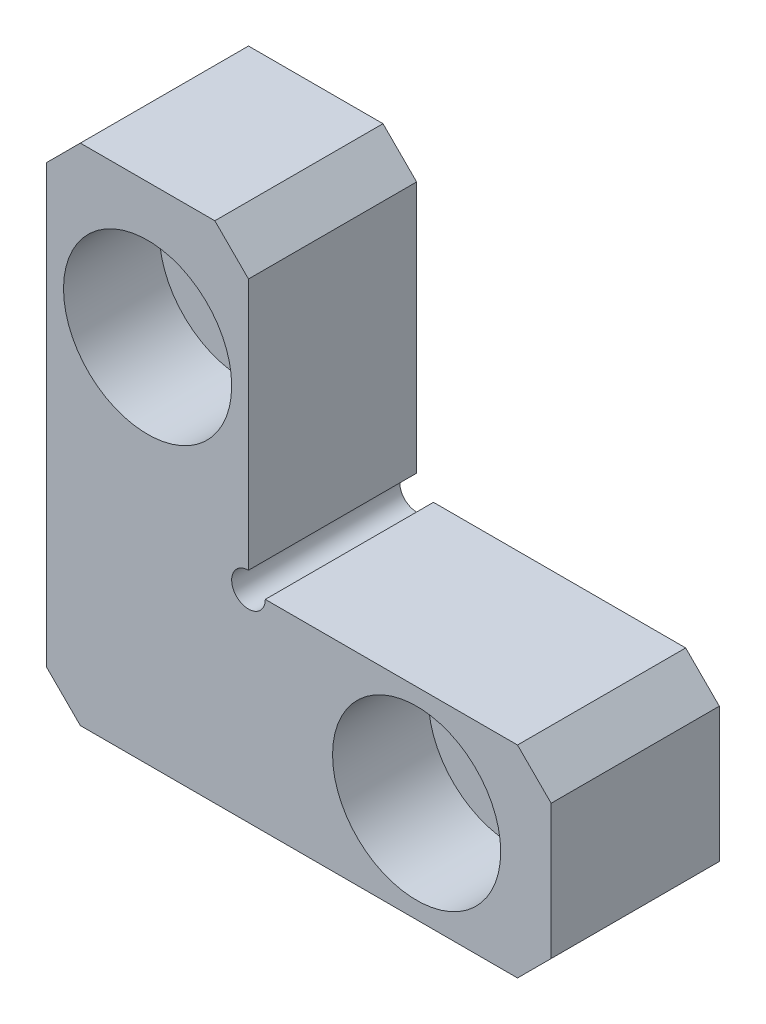
ISO-10303-21;
HEADER;
FILE_DESCRIPTION(('STEP AP214'),'2;1');
FILE_NAME('part.step','',(''),(''),'','','');
FILE_SCHEMA(('AUTOMOTIVE_DESIGN { 1 0 10303 214 1 1 1 1 }'));
ENDSEC;
DATA;
#1=APPLICATION_CONTEXT('core data for automotive mechanical design processes');
#2=APPLICATION_PROTOCOL_DEFINITION('international standard','automotive_design',2000,#1);
#3=PRODUCT_CONTEXT('',#1,'mechanical');
#4=PRODUCT('Part','Part','',(#3));
#5=PRODUCT_RELATED_PRODUCT_CATEGORY('part','',(#4));
#6=PRODUCT_DEFINITION_FORMATION('','',#4);
#7=PRODUCT_DEFINITION_CONTEXT('part definition',#1,'design');
#8=PRODUCT_DEFINITION('design','',#6,#7);
#9=PRODUCT_DEFINITION_SHAPE('','',#8);
#10=(LENGTH_UNIT() NAMED_UNIT(*) SI_UNIT(.MILLI.,.METRE.));
#11=(NAMED_UNIT(*) PLANE_ANGLE_UNIT() SI_UNIT($,.RADIAN.));
#12=(NAMED_UNIT(*) SI_UNIT($,.STERADIAN.) SOLID_ANGLE_UNIT());
#13=UNCERTAINTY_MEASURE_WITH_UNIT(LENGTH_MEASURE(1.E-05),#10,'distance_accuracy_value','');
#14=(GEOMETRIC_REPRESENTATION_CONTEXT(3) GLOBAL_UNCERTAINTY_ASSIGNED_CONTEXT((#13)) GLOBAL_UNIT_ASSIGNED_CONTEXT((#10,
#11,#12)) REPRESENTATION_CONTEXT('',''));
#15=CARTESIAN_POINT('',(0.,0.,0.));
#16=DIRECTION('',(0.,0.,1.));
#17=DIRECTION('',(1.,0.,0.));
#18=AXIS2_PLACEMENT_3D('',#15,#16,#17);
#19=CARTESIAN_POINT('',(30.,0.,5.));
#20=DIRECTION('',(0.,1.,0.));
#21=DIRECTION('',(-1.,0.,0.));
#22=AXIS2_PLACEMENT_3D('',#19,#20,#21);
#23=PLANE('',#22);
#24=DIRECTION('',(1.,0.,0.));
#25=VECTOR('',#24,1.);
#26=CARTESIAN_POINT('',(30.,0.,5.));
#27=LINE('',#26,#25);
#28=CARTESIAN_POINT('',(2.,0.,5.));
#29=VERTEX_POINT('',#28);
#30=CARTESIAN_POINT('',(28.,0.,5.));
#31=VERTEX_POINT('',#30);
#32=EDGE_CURVE('E159',#29,#31,#27,.T.);
#33=ORIENTED_EDGE('',*,*,#32,.F.);
#34=DIRECTION('',(0.,0.,-1.));
#35=VECTOR('',#34,1.);
#36=CARTESIAN_POINT('',(2.,0.,5.));
#37=LINE('',#36,#35);
#38=CARTESIAN_POINT('',(2.,0.,-5.));
#39=VERTEX_POINT('',#38);
#40=EDGE_CURVE('E162',#29,#39,#37,.T.);
#41=ORIENTED_EDGE('',*,*,#40,.T.);
#42=DIRECTION('',(1.,0.,0.));
#43=VECTOR('',#42,1.);
#44=CARTESIAN_POINT('',(30.,0.,-5.));
#45=LINE('',#44,#43);
#46=CARTESIAN_POINT('',(28.,0.,-5.));
#47=VERTEX_POINT('',#46);
#48=EDGE_CURVE('E218',#39,#47,#45,.T.);
#49=ORIENTED_EDGE('',*,*,#48,.T.);
#50=DIRECTION('',(0.,0.,1.));
#51=VECTOR('',#50,1.);
#52=CARTESIAN_POINT('',(28.,0.,5.));
#53=LINE('',#52,#51);
#54=EDGE_CURVE('E160',#47,#31,#53,.T.);
#55=ORIENTED_EDGE('',*,*,#54,.T.);
#56=EDGE_LOOP('',(#33,#41,#49,#55));
#57=FACE_BOUND('',#56,.T.);
#58=ADVANCED_FACE('F38',(#57),#23,.F.);
#59=CARTESIAN_POINT('',(30.,12.,5.));
#60=DIRECTION('',(-1.,0.,0.));
#61=DIRECTION('',(0.,0.,1.));
#62=AXIS2_PLACEMENT_3D('',#59,#60,#61);
#63=PLANE('',#62);
#64=DIRECTION('',(0.,1.,0.));
#65=VECTOR('',#64,1.);
#66=CARTESIAN_POINT('',(30.,12.,5.));
#67=LINE('',#66,#65);
#68=CARTESIAN_POINT('',(30.,2.,5.));
#69=VERTEX_POINT('',#68);
#70=CARTESIAN_POINT('',(30.,9.99999999999999,5.));
#71=VERTEX_POINT('',#70);
#72=EDGE_CURVE('E234',#69,#71,#67,.T.);
#73=ORIENTED_EDGE('',*,*,#72,.F.);
#74=DIRECTION('',(0.,0.,-1.));
#75=VECTOR('',#74,1.);
#76=CARTESIAN_POINT('',(30.,2.,5.));
#77=LINE('',#76,#75);
#78=CARTESIAN_POINT('',(30.,2.,-5.));
#79=VERTEX_POINT('',#78);
#80=EDGE_CURVE('E192',#69,#79,#77,.T.);
#81=ORIENTED_EDGE('',*,*,#80,.T.);
#82=DIRECTION('',(0.,1.,0.));
#83=VECTOR('',#82,1.);
#84=CARTESIAN_POINT('',(30.,12.,-5.));
#85=LINE('',#84,#83);
#86=CARTESIAN_POINT('',(30.,9.99999999999999,-5.));
#87=VERTEX_POINT('',#86);
#88=EDGE_CURVE('E153',#79,#87,#85,.T.);
#89=ORIENTED_EDGE('',*,*,#88,.T.);
#90=DIRECTION('',(0.,0.,1.));
#91=VECTOR('',#90,1.);
#92=CARTESIAN_POINT('',(30.,9.99999999999999,5.));
#93=LINE('',#92,#91);
#94=EDGE_CURVE('E190',#87,#71,#93,.T.);
#95=ORIENTED_EDGE('',*,*,#94,.T.);
#96=EDGE_LOOP('',(#73,#81,#89,#95));
#97=FACE_BOUND('',#96,.T.);
#98=ADVANCED_FACE('F226',(#97),#63,.F.);
#99=CARTESIAN_POINT('',(12.,12.,5.));
#100=DIRECTION('',(0.,-1.,0.));
#101=DIRECTION('',(1.,0.,0.));
#102=AXIS2_PLACEMENT_3D('',#99,#100,#101);
#103=PLANE('',#102);
#104=DIRECTION('',(-1.,0.,0.));
#105=VECTOR('',#104,1.);
#106=CARTESIAN_POINT('',(12.,12.,-5.));
#107=LINE('',#106,#105);
#108=CARTESIAN_POINT('',(28.,12.,-5.));
#109=VERTEX_POINT('',#108);
#110=CARTESIAN_POINT('',(13.,12.,-5.));
#111=VERTEX_POINT('',#110);
#112=EDGE_CURVE('E149',#109,#111,#107,.T.);
#113=ORIENTED_EDGE('',*,*,#112,.T.);
#114=DIRECTION('',(0.,0.,1.));
#115=VECTOR('',#114,1.);
#116=CARTESIAN_POINT('',(13.,12.,-5.));
#117=LINE('',#116,#115);
#118=CARTESIAN_POINT('',(13.,12.,5.));
#119=VERTEX_POINT('',#118);
#120=EDGE_CURVE('E53',#111,#119,#117,.T.);
#121=ORIENTED_EDGE('',*,*,#120,.T.);
#122=DIRECTION('',(-1.,0.,0.));
#123=VECTOR('',#122,1.);
#124=CARTESIAN_POINT('',(12.,12.,5.));
#125=LINE('',#124,#123);
#126=CARTESIAN_POINT('',(28.,12.,5.));
#127=VERTEX_POINT('',#126);
#128=EDGE_CURVE('E214',#127,#119,#125,.T.);
#129=ORIENTED_EDGE('',*,*,#128,.F.);
#130=DIRECTION('',(0.,0.,-1.));
#131=VECTOR('',#130,1.);
#132=CARTESIAN_POINT('',(28.,12.,5.));
#133=LINE('',#132,#131);
#134=EDGE_CURVE('E195',#127,#109,#133,.T.);
#135=ORIENTED_EDGE('',*,*,#134,.T.);
#136=EDGE_LOOP('',(#113,#121,#129,#135));
#137=FACE_BOUND('',#136,.T.);
#138=ADVANCED_FACE('F236',(#137),#103,.F.);
#139=CARTESIAN_POINT('',(12.,30.,5.));
#140=DIRECTION('',(-1.,0.,0.));
#141=DIRECTION('',(0.,-1.,0.));
#142=AXIS2_PLACEMENT_3D('',#139,#140,#141);
#143=PLANE('',#142);
#144=DIRECTION('',(0.,1.,0.));
#145=VECTOR('',#144,1.);
#146=CARTESIAN_POINT('',(12.,30.,5.));
#147=LINE('',#146,#145);
#148=CARTESIAN_POINT('',(12.,13.,5.));
#149=VERTEX_POINT('',#148);
#150=CARTESIAN_POINT('',(12.,28.,5.));
#151=VERTEX_POINT('',#150);
#152=EDGE_CURVE('E140',#149,#151,#147,.T.);
#153=ORIENTED_EDGE('',*,*,#152,.F.);
#154=DIRECTION('',(0.,0.,1.));
#155=VECTOR('',#154,1.);
#156=CARTESIAN_POINT('',(12.,13.,-5.));
#157=LINE('',#156,#155);
#158=CARTESIAN_POINT('',(12.,13.,-5.));
#159=VERTEX_POINT('',#158);
#160=EDGE_CURVE('E128',#149,#159,#157,.F.);
#161=ORIENTED_EDGE('',*,*,#160,.T.);
#162=DIRECTION('',(0.,1.,0.));
#163=VECTOR('',#162,1.);
#164=CARTESIAN_POINT('',(12.,30.,-5.));
#165=LINE('',#164,#163);
#166=CARTESIAN_POINT('',(12.,28.,-5.));
#167=VERTEX_POINT('',#166);
#168=EDGE_CURVE('E138',#159,#167,#165,.T.);
#169=ORIENTED_EDGE('',*,*,#168,.T.);
#170=DIRECTION('',(0.,0.,1.));
#171=VECTOR('',#170,1.);
#172=CARTESIAN_POINT('',(12.,28.,5.));
#173=LINE('',#172,#171);
#174=EDGE_CURVE('E47',#167,#151,#173,.T.);
#175=ORIENTED_EDGE('',*,*,#174,.T.);
#176=EDGE_LOOP('',(#153,#161,#169,#175));
#177=FACE_BOUND('',#176,.T.);
#178=ADVANCED_FACE('F136',(#177),#143,.F.);
#179=CARTESIAN_POINT('',(0.,30.,5.));
#180=DIRECTION('',(0.,-1.,0.));
#181=DIRECTION('',(0.,0.,-1.));
#182=AXIS2_PLACEMENT_3D('',#179,#180,#181);
#183=PLANE('',#182);
#184=DIRECTION('',(-1.,0.,0.));
#185=VECTOR('',#184,1.);
#186=CARTESIAN_POINT('',(0.,30.,5.));
#187=LINE('',#186,#185);
#188=CARTESIAN_POINT('',(10.,30.,5.));
#189=VERTEX_POINT('',#188);
#190=CARTESIAN_POINT('',(2.,30.,5.));
#191=VERTEX_POINT('',#190);
#192=EDGE_CURVE('E208',#189,#191,#187,.T.);
#193=ORIENTED_EDGE('',*,*,#192,.F.);
#194=DIRECTION('',(0.,0.,-1.));
#195=VECTOR('',#194,1.);
#196=CARTESIAN_POINT('',(10.,30.,5.));
#197=LINE('',#196,#195);
#198=CARTESIAN_POINT('',(10.,30.,-5.));
#199=VERTEX_POINT('',#198);
#200=EDGE_CURVE('E199',#189,#199,#197,.T.);
#201=ORIENTED_EDGE('',*,*,#200,.T.);
#202=DIRECTION('',(-1.,0.,0.));
#203=VECTOR('',#202,1.);
#204=CARTESIAN_POINT('',(0.,30.,-5.));
#205=LINE('',#204,#203);
#206=CARTESIAN_POINT('',(2.,30.,-5.));
#207=VERTEX_POINT('',#206);
#208=EDGE_CURVE('E148',#199,#207,#205,.T.);
#209=ORIENTED_EDGE('',*,*,#208,.T.);
#210=DIRECTION('',(0.,0.,1.));
#211=VECTOR('',#210,1.);
#212=CARTESIAN_POINT('',(2.,30.,5.));
#213=LINE('',#212,#211);
#214=EDGE_CURVE('E61',#207,#191,#213,.T.);
#215=ORIENTED_EDGE('',*,*,#214,.T.);
#216=EDGE_LOOP('',(#193,#201,#209,#215));
#217=FACE_BOUND('',#216,.T.);
#218=ADVANCED_FACE('F210',(#217),#183,.F.);
#219=CARTESIAN_POINT('',(0.,0.,5.));
#220=DIRECTION('',(1.,0.,0.));
#221=DIRECTION('',(0.,0.,-1.));
#222=AXIS2_PLACEMENT_3D('',#219,#220,#221);
#223=PLANE('',#222);
#224=DIRECTION('',(0.,-1.,0.));
#225=VECTOR('',#224,1.);
#226=CARTESIAN_POINT('',(0.,0.,-5.));
#227=LINE('',#226,#225);
#228=CARTESIAN_POINT('',(0.,28.,-5.));
#229=VERTEX_POINT('',#228);
#230=CARTESIAN_POINT('',(0.,2.,-5.));
#231=VERTEX_POINT('',#230);
#232=EDGE_CURVE('E151',#229,#231,#227,.T.);
#233=ORIENTED_EDGE('',*,*,#232,.T.);
#234=DIRECTION('',(0.,0.,1.));
#235=VECTOR('',#234,1.);
#236=CARTESIAN_POINT('',(0.,2.,5.));
#237=LINE('',#236,#235);
#238=CARTESIAN_POINT('',(0.,2.,5.));
#239=VERTEX_POINT('',#238);
#240=EDGE_CURVE('E178',#231,#239,#237,.T.);
#241=ORIENTED_EDGE('',*,*,#240,.T.);
#242=DIRECTION('',(0.,-1.,0.));
#243=VECTOR('',#242,1.);
#244=CARTESIAN_POINT('',(0.,0.,5.));
#245=LINE('',#244,#243);
#246=CARTESIAN_POINT('',(0.,28.,5.));
#247=VERTEX_POINT('',#246);
#248=EDGE_CURVE('E163',#247,#239,#245,.T.);
#249=ORIENTED_EDGE('',*,*,#248,.F.);
#250=DIRECTION('',(0.,0.,-1.));
#251=VECTOR('',#250,1.);
#252=CARTESIAN_POINT('',(0.,28.,5.));
#253=LINE('',#252,#251);
#254=EDGE_CURVE('E175',#247,#229,#253,.T.);
#255=ORIENTED_EDGE('',*,*,#254,.T.);
#256=EDGE_LOOP('',(#233,#241,#249,#255));
#257=FACE_BOUND('',#256,.T.);
#258=ADVANCED_FACE('F271',(#257),#223,.F.);
#259=CARTESIAN_POINT('',(0.,0.,5.));
#260=DIRECTION('',(0.,0.,-1.));
#261=DIRECTION('',(-1.,0.,0.));
#262=AXIS2_PLACEMENT_3D('',#259,#260,#261);
#263=PLANE('',#262);
#264=CARTESIAN_POINT('',(6.,22.,5.));
#265=DIRECTION('',(0.,0.,1.));
#266=DIRECTION('',(1.,0.,0.));
#267=AXIS2_PLACEMENT_3D('',#264,#265,#266);
#268=CIRCLE('',#267,5.);
#269=CARTESIAN_POINT('',(11.,22.,5.));
#270=VERTEX_POINT('',#269);
#271=EDGE_CURVE('E261',#270,#270,#268,.T.);
#272=ORIENTED_EDGE('',*,*,#271,.F.);
#273=EDGE_LOOP('',(#272));
#274=FACE_BOUND('',#273,.T.);
#275=CARTESIAN_POINT('',(22.,6.,5.));
#276=DIRECTION('',(0.,0.,1.));
#277=DIRECTION('',(1.,0.,0.));
#278=AXIS2_PLACEMENT_3D('',#275,#276,#277);
#279=CIRCLE('',#278,5.);
#280=CARTESIAN_POINT('',(27.,6.,5.));
#281=VERTEX_POINT('',#280);
#282=EDGE_CURVE('E249',#281,#281,#279,.T.);
#283=ORIENTED_EDGE('',*,*,#282,.F.);
#284=EDGE_LOOP('',(#283));
#285=FACE_BOUND('',#284,.T.);
#286=ORIENTED_EDGE('',*,*,#128,.T.);
#287=CARTESIAN_POINT('',(12.,12.,5.));
#288=DIRECTION('',(0.,0.,1.));
#289=DIRECTION('',(1.,0.,0.));
#290=AXIS2_PLACEMENT_3D('',#287,#288,#289);
#291=CIRCLE('',#290,0.999999999999999);
#292=EDGE_CURVE('E141',#149,#119,#291,.T.);
#293=ORIENTED_EDGE('',*,*,#292,.F.);
#294=ORIENTED_EDGE('',*,*,#152,.T.);
#295=DIRECTION('',(0.707106781186546,-0.707106781186549,0.));
#296=VECTOR('',#295,1.);
#297=CARTESIAN_POINT('',(10.,30.,5.));
#298=LINE('',#297,#296);
#299=EDGE_CURVE('E182',#151,#189,#298,.F.);
#300=ORIENTED_EDGE('',*,*,#299,.T.);
#301=ORIENTED_EDGE('',*,*,#192,.T.);
#302=DIRECTION('',(0.707106781186548,0.707106781186547,0.));
#303=VECTOR('',#302,1.);
#304=CARTESIAN_POINT('',(0.,28.,5.));
#305=LINE('',#304,#303);
#306=EDGE_CURVE('E180',#191,#247,#305,.F.);
#307=ORIENTED_EDGE('',*,*,#306,.T.);
#308=ORIENTED_EDGE('',*,*,#248,.T.);
#309=DIRECTION('',(-0.707106781186547,0.707106781186548,0.));
#310=VECTOR('',#309,1.);
#311=CARTESIAN_POINT('',(2.,0.,5.));
#312=LINE('',#311,#310);
#313=EDGE_CURVE('E188',#239,#29,#312,.F.);
#314=ORIENTED_EDGE('',*,*,#313,.T.);
#315=ORIENTED_EDGE('',*,*,#32,.T.);
#316=DIRECTION('',(-0.707106781186549,-0.707106781186546,0.));
#317=VECTOR('',#316,1.);
#318=CARTESIAN_POINT('',(30.,2.,5.));
#319=LINE('',#318,#317);
#320=EDGE_CURVE('E186',#31,#69,#319,.F.);
#321=ORIENTED_EDGE('',*,*,#320,.T.);
#322=ORIENTED_EDGE('',*,*,#72,.T.);
#323=DIRECTION('',(0.707106781186545,-0.70710678118655,0.));
#324=VECTOR('',#323,1.);
#325=CARTESIAN_POINT('',(28.,12.,5.));
#326=LINE('',#325,#324);
#327=EDGE_CURVE('E184',#71,#127,#326,.F.);
#328=ORIENTED_EDGE('',*,*,#327,.T.);
#329=EDGE_LOOP('',(#286,#293,#294,#300,#301,#307,#308,#314,#315,#321,#322,#328));
#330=FACE_BOUND('',#329,.T.);
#331=ADVANCED_FACE('F207',(#274,#285,#330),#263,.F.);
#332=CARTESIAN_POINT('',(0.,0.,-5.));
#333=DIRECTION('',(0.,0.,-1.));
#334=DIRECTION('',(-1.,0.,0.));
#335=AXIS2_PLACEMENT_3D('',#332,#333,#334);
#336=PLANE('',#335);
#337=CARTESIAN_POINT('',(12.,12.,-5.));
#338=DIRECTION('',(0.,0.,-1.));
#339=DIRECTION('',(-1.,0.,0.));
#340=AXIS2_PLACEMENT_3D('',#337,#338,#339);
#341=CIRCLE('',#340,0.999999999999999);
#342=EDGE_CURVE('E11',#111,#159,#341,.T.);
#343=ORIENTED_EDGE('',*,*,#342,.F.);
#344=ORIENTED_EDGE('',*,*,#112,.F.);
#345=DIRECTION('',(-0.707106781186545,0.70710678118655,0.));
#346=VECTOR('',#345,1.);
#347=CARTESIAN_POINT('',(20.0000000000001,20.,-5.));
#348=LINE('',#347,#346);
#349=EDGE_CURVE('E169',#109,#87,#348,.F.);
#350=ORIENTED_EDGE('',*,*,#349,.T.);
#351=ORIENTED_EDGE('',*,*,#88,.F.);
#352=DIRECTION('',(0.707106781186549,0.707106781186546,0.));
#353=VECTOR('',#352,1.);
#354=CARTESIAN_POINT('',(13.9999999999999,-14.,-5.));
#355=LINE('',#354,#353);
#356=EDGE_CURVE('E171',#79,#47,#355,.F.);
#357=ORIENTED_EDGE('',*,*,#356,.T.);
#358=ORIENTED_EDGE('',*,*,#48,.F.);
#359=DIRECTION('',(0.707106781186547,-0.707106781186548,0.));
#360=VECTOR('',#359,1.);
#361=CARTESIAN_POINT('',(1.,0.999999999999999,-5.));
#362=LINE('',#361,#360);
#363=EDGE_CURVE('E173',#39,#231,#362,.F.);
#364=ORIENTED_EDGE('',*,*,#363,.T.);
#365=ORIENTED_EDGE('',*,*,#232,.F.);
#366=DIRECTION('',(-0.707106781186548,-0.707106781186547,0.));
#367=VECTOR('',#366,1.);
#368=CARTESIAN_POINT('',(-14.,14.,-5.));
#369=LINE('',#368,#367);
#370=EDGE_CURVE('E166',#229,#207,#369,.F.);
#371=ORIENTED_EDGE('',*,*,#370,.T.);
#372=ORIENTED_EDGE('',*,*,#208,.F.);
#373=DIRECTION('',(-0.707106781186546,0.707106781186549,0.));
#374=VECTOR('',#373,1.);
#375=CARTESIAN_POINT('',(20.,19.9999999999999,-5.));
#376=LINE('',#375,#374);
#377=EDGE_CURVE('E146',#199,#167,#376,.F.);
#378=ORIENTED_EDGE('',*,*,#377,.T.);
#379=ORIENTED_EDGE('',*,*,#168,.F.);
#380=EDGE_LOOP('',(#343,#344,#350,#351,#357,#358,#364,#365,#371,#372,#378,#379));
#381=FACE_BOUND('',#380,.T.);
#382=CARTESIAN_POINT('',(6.,22.,-5.));
#383=DIRECTION('',(0.,0.,1.));
#384=DIRECTION('',(1.,0.,0.));
#385=AXIS2_PLACEMENT_3D('',#382,#383,#384);
#386=CIRCLE('',#385,2.75);
#387=CARTESIAN_POINT('',(8.75,22.,-5.));
#388=VERTEX_POINT('',#387);
#389=EDGE_CURVE('E252',#388,#388,#386,.T.);
#390=ORIENTED_EDGE('',*,*,#389,.T.);
#391=EDGE_LOOP('',(#390));
#392=FACE_BOUND('',#391,.T.);
#393=CARTESIAN_POINT('',(22.,6.,-5.));
#394=DIRECTION('',(0.,0.,1.));
#395=DIRECTION('',(1.,0.,0.));
#396=AXIS2_PLACEMENT_3D('',#393,#394,#395);
#397=CIRCLE('',#396,2.75);
#398=CARTESIAN_POINT('',(24.75,6.,-5.));
#399=VERTEX_POINT('',#398);
#400=EDGE_CURVE('E220',#399,#399,#397,.T.);
#401=ORIENTED_EDGE('',*,*,#400,.T.);
#402=EDGE_LOOP('',(#401));
#403=FACE_BOUND('',#402,.T.);
#404=ADVANCED_FACE('F143',(#381,#392,#403),#336,.T.);
#405=CARTESIAN_POINT('',(22.,6.,5.));
#406=DIRECTION('',(0.,0.,1.));
#407=DIRECTION('',(1.,0.,0.));
#408=AXIS2_PLACEMENT_3D('',#405,#406,#407);
#409=CYLINDRICAL_SURFACE('',#408,2.75);
#410=ORIENTED_EDGE('',*,*,#400,.F.);
#411=EDGE_LOOP('',(#410));
#412=FACE_BOUND('',#411,.T.);
#413=CARTESIAN_POINT('',(22.,6.,-0.7));
#414=DIRECTION('',(0.,0.,1.));
#415=DIRECTION('',(1.,0.,0.));
#416=AXIS2_PLACEMENT_3D('',#413,#414,#415);
#417=CIRCLE('',#416,2.75);
#418=CARTESIAN_POINT('',(24.75,6.,-0.7));
#419=VERTEX_POINT('',#418);
#420=EDGE_CURVE('E243',#419,#419,#417,.T.);
#421=ORIENTED_EDGE('',*,*,#420,.T.);
#422=EDGE_LOOP('',(#421));
#423=FACE_BOUND('',#422,.T.);
#424=ADVANCED_FACE('F288',(#412,#423),#409,.F.);
#425=CARTESIAN_POINT('',(24.75,6.,-0.7));
#426=DIRECTION('',(0.,0.,-1.));
#427=DIRECTION('',(-1.,0.,0.));
#428=AXIS2_PLACEMENT_3D('',#425,#426,#427);
#429=PLANE('',#428);
#430=ORIENTED_EDGE('',*,*,#420,.F.);
#431=EDGE_LOOP('',(#430));
#432=FACE_BOUND('',#431,.T.);
#433=CARTESIAN_POINT('',(22.,6.,-0.7));
#434=DIRECTION('',(0.,0.,1.));
#435=DIRECTION('',(1.,0.,0.));
#436=AXIS2_PLACEMENT_3D('',#433,#434,#435);
#437=CIRCLE('',#436,5.);
#438=CARTESIAN_POINT('',(27.,6.,-0.7));
#439=VERTEX_POINT('',#438);
#440=EDGE_CURVE('E246',#439,#439,#437,.T.);
#441=ORIENTED_EDGE('',*,*,#440,.T.);
#442=EDGE_LOOP('',(#441));
#443=FACE_BOUND('',#442,.T.);
#444=ADVANCED_FACE('F278',(#432,#443),#429,.F.);
#445=CARTESIAN_POINT('',(22.,6.,5.));
#446=DIRECTION('',(0.,0.,1.));
#447=DIRECTION('',(1.,0.,0.));
#448=AXIS2_PLACEMENT_3D('',#445,#446,#447);
#449=CYLINDRICAL_SURFACE('',#448,5.);
#450=ORIENTED_EDGE('',*,*,#440,.F.);
#451=EDGE_LOOP('',(#450));
#452=FACE_BOUND('',#451,.T.);
#453=ORIENTED_EDGE('',*,*,#282,.T.);
#454=EDGE_LOOP('',(#453));
#455=FACE_BOUND('',#454,.T.);
#456=ADVANCED_FACE('F275',(#452,#455),#449,.F.);
#457=CARTESIAN_POINT('',(6.,22.,5.));
#458=DIRECTION('',(0.,0.,1.));
#459=DIRECTION('',(1.,0.,0.));
#460=AXIS2_PLACEMENT_3D('',#457,#458,#459);
#461=CYLINDRICAL_SURFACE('',#460,2.75);
#462=ORIENTED_EDGE('',*,*,#389,.F.);
#463=EDGE_LOOP('',(#462));
#464=FACE_BOUND('',#463,.T.);
#465=CARTESIAN_POINT('',(6.,22.,-0.7));
#466=DIRECTION('',(0.,0.,1.));
#467=DIRECTION('',(1.,0.,0.));
#468=AXIS2_PLACEMENT_3D('',#465,#466,#467);
#469=CIRCLE('',#468,2.75);
#470=CARTESIAN_POINT('',(8.75,22.,-0.7));
#471=VERTEX_POINT('',#470);
#472=EDGE_CURVE('E255',#471,#471,#469,.T.);
#473=ORIENTED_EDGE('',*,*,#472,.T.);
#474=EDGE_LOOP('',(#473));
#475=FACE_BOUND('',#474,.T.);
#476=ADVANCED_FACE('F277',(#464,#475),#461,.F.);
#477=CARTESIAN_POINT('',(8.75,22.,-0.7));
#478=DIRECTION('',(0.,0.,-1.));
#479=DIRECTION('',(-1.,0.,0.));
#480=AXIS2_PLACEMENT_3D('',#477,#478,#479);
#481=PLANE('',#480);
#482=ORIENTED_EDGE('',*,*,#472,.F.);
#483=EDGE_LOOP('',(#482));
#484=FACE_BOUND('',#483,.T.);
#485=CARTESIAN_POINT('',(6.,22.,-0.7));
#486=DIRECTION('',(0.,0.,1.));
#487=DIRECTION('',(1.,0.,0.));
#488=AXIS2_PLACEMENT_3D('',#485,#486,#487);
#489=CIRCLE('',#488,5.);
#490=CARTESIAN_POINT('',(11.,22.,-0.7));
#491=VERTEX_POINT('',#490);
#492=EDGE_CURVE('E258',#491,#491,#489,.T.);
#493=ORIENTED_EDGE('',*,*,#492,.T.);
#494=EDGE_LOOP('',(#493));
#495=FACE_BOUND('',#494,.T.);
#496=ADVANCED_FACE('F285',(#484,#495),#481,.F.);
#497=CARTESIAN_POINT('',(6.,22.,5.));
#498=DIRECTION('',(0.,0.,1.));
#499=DIRECTION('',(1.,0.,0.));
#500=AXIS2_PLACEMENT_3D('',#497,#498,#499);
#501=CYLINDRICAL_SURFACE('',#500,5.);
#502=ORIENTED_EDGE('',*,*,#492,.F.);
#503=EDGE_LOOP('',(#502));
#504=FACE_BOUND('',#503,.T.);
#505=ORIENTED_EDGE('',*,*,#271,.T.);
#506=EDGE_LOOP('',(#505));
#507=FACE_BOUND('',#506,.T.);
#508=ADVANCED_FACE('F267',(#504,#507),#501,.F.);
#509=CARTESIAN_POINT('',(2.,0.,5.));
#510=DIRECTION('',(0.707106781186548,0.707106781186547,0.));
#511=DIRECTION('',(0.,0.,-1.));
#512=AXIS2_PLACEMENT_3D('',#509,#510,#511);
#513=PLANE('',#512);
#514=ORIENTED_EDGE('',*,*,#313,.F.);
#515=ORIENTED_EDGE('',*,*,#240,.F.);
#516=ORIENTED_EDGE('',*,*,#363,.F.);
#517=ORIENTED_EDGE('',*,*,#40,.F.);
#518=EDGE_LOOP('',(#514,#515,#516,#517));
#519=FACE_BOUND('',#518,.T.);
#520=ADVANCED_FACE('F303',(#519),#513,.F.);
#521=CARTESIAN_POINT('',(30.,2.,5.));
#522=DIRECTION('',(-0.707106781186546,0.707106781186549,0.));
#523=DIRECTION('',(0.,0.,-1.));
#524=AXIS2_PLACEMENT_3D('',#521,#522,#523);
#525=PLANE('',#524);
#526=ORIENTED_EDGE('',*,*,#320,.F.);
#527=ORIENTED_EDGE('',*,*,#54,.F.);
#528=ORIENTED_EDGE('',*,*,#356,.F.);
#529=ORIENTED_EDGE('',*,*,#80,.F.);
#530=EDGE_LOOP('',(#526,#527,#528,#529));
#531=FACE_BOUND('',#530,.T.);
#532=ADVANCED_FACE('F309',(#531),#525,.F.);
#533=CARTESIAN_POINT('',(28.,12.,5.));
#534=DIRECTION('',(-0.70710678118655,-0.707106781186545,0.));
#535=DIRECTION('',(0.,0.,-1.));
#536=AXIS2_PLACEMENT_3D('',#533,#534,#535);
#537=PLANE('',#536);
#538=ORIENTED_EDGE('',*,*,#327,.F.);
#539=ORIENTED_EDGE('',*,*,#94,.F.);
#540=ORIENTED_EDGE('',*,*,#349,.F.);
#541=ORIENTED_EDGE('',*,*,#134,.F.);
#542=EDGE_LOOP('',(#538,#539,#540,#541));
#543=FACE_BOUND('',#542,.T.);
#544=ADVANCED_FACE('F231',(#543),#537,.F.);
#545=CARTESIAN_POINT('',(10.,30.,5.));
#546=DIRECTION('',(-0.707106781186549,-0.707106781186546,0.));
#547=DIRECTION('',(0.,0.,-1.));
#548=AXIS2_PLACEMENT_3D('',#545,#546,#547);
#549=PLANE('',#548);
#550=ORIENTED_EDGE('',*,*,#299,.F.);
#551=ORIENTED_EDGE('',*,*,#174,.F.);
#552=ORIENTED_EDGE('',*,*,#377,.F.);
#553=ORIENTED_EDGE('',*,*,#200,.F.);
#554=EDGE_LOOP('',(#550,#551,#552,#553));
#555=FACE_BOUND('',#554,.T.);
#556=ADVANCED_FACE('F204',(#555),#549,.F.);
#557=CARTESIAN_POINT('',(0.,28.,5.));
#558=DIRECTION('',(0.707106781186547,-0.707106781186548,0.));
#559=DIRECTION('',(0.,0.,-1.));
#560=AXIS2_PLACEMENT_3D('',#557,#558,#559);
#561=PLANE('',#560);
#562=ORIENTED_EDGE('',*,*,#306,.F.);
#563=ORIENTED_EDGE('',*,*,#214,.F.);
#564=ORIENTED_EDGE('',*,*,#370,.F.);
#565=ORIENTED_EDGE('',*,*,#254,.F.);
#566=EDGE_LOOP('',(#562,#563,#564,#565));
#567=FACE_BOUND('',#566,.T.);
#568=ADVANCED_FACE('F41',(#567),#561,.F.);
#569=CARTESIAN_POINT('',(12.,12.,-5.));
#570=DIRECTION('',(0.,0.,1.));
#571=DIRECTION('',(1.,0.,0.));
#572=AXIS2_PLACEMENT_3D('',#569,#570,#571);
#573=CYLINDRICAL_SURFACE('',#572,0.999999999999999);
#574=ORIENTED_EDGE('',*,*,#342,.T.);
#575=ORIENTED_EDGE('',*,*,#160,.F.);
#576=ORIENTED_EDGE('',*,*,#292,.T.);
#577=ORIENTED_EDGE('',*,*,#120,.F.);
#578=EDGE_LOOP('',(#574,#575,#576,#577));
#579=FACE_BOUND('',#578,.T.);
#580=ADVANCED_FACE('F127',(#579),#573,.F.);
#581=CLOSED_SHELL('',(#58,#98,#138,#178,#218,#258,#331,#404,#424,#444,#456,#476,#496,#508,#520,
#532,#544,#556,#568,#580));
#582=MANIFOLD_SOLID_BREP('B2',#581);
#583=ADVANCED_BREP_SHAPE_REPRESENTATION('',(#18,#582),#14);
#584=SHAPE_DEFINITION_REPRESENTATION(#9,#583);
ENDSEC;
END-ISO-10303-21;
